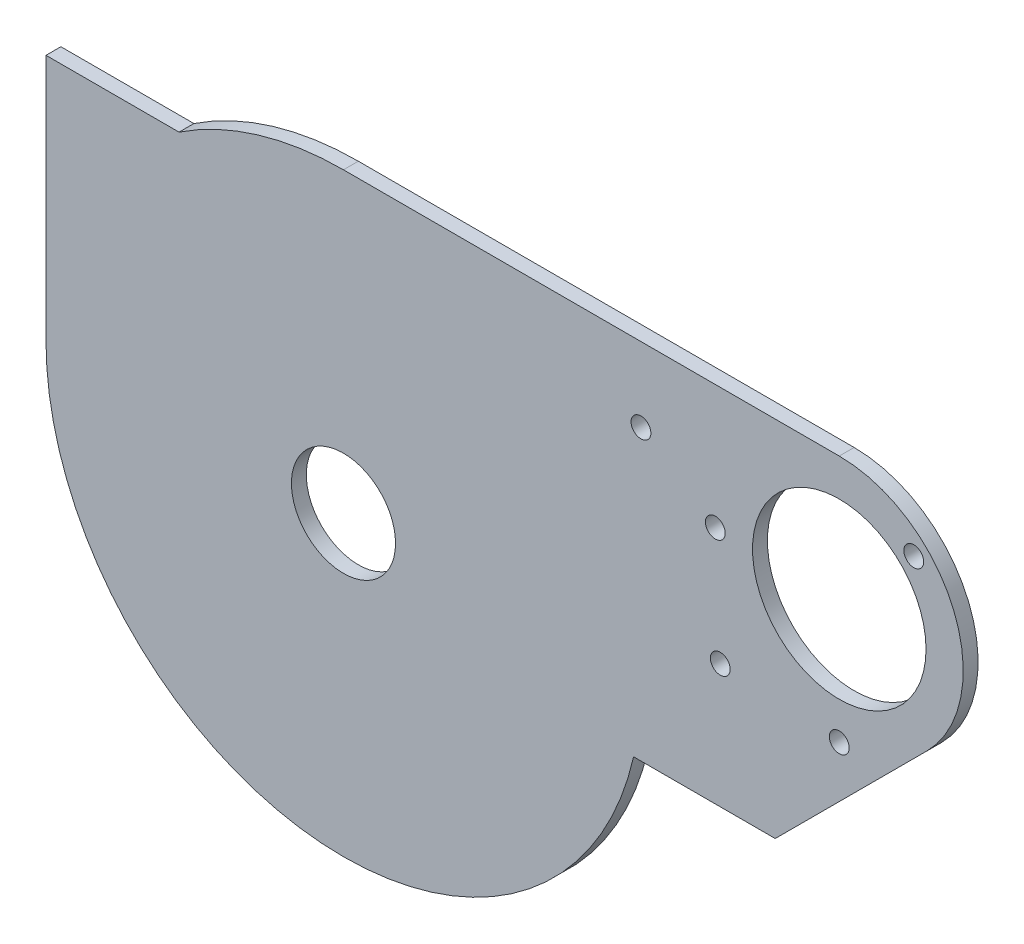
ISO-10303-21;
HEADER;
FILE_DESCRIPTION(('STEP AP214'),'2;1');
FILE_NAME('part.step','',(''),(''),'','','');
FILE_SCHEMA(('AUTOMOTIVE_DESIGN { 1 0 10303 214 1 1 1 1 }'));
ENDSEC;
DATA;
#1=APPLICATION_CONTEXT('core data for automotive mechanical design processes');
#2=APPLICATION_PROTOCOL_DEFINITION('international standard','automotive_design',2000,#1);
#3=PRODUCT_CONTEXT('',#1,'mechanical');
#4=PRODUCT('Part','Part','',(#3));
#5=PRODUCT_RELATED_PRODUCT_CATEGORY('part','',(#4));
#6=PRODUCT_DEFINITION_FORMATION('','',#4);
#7=PRODUCT_DEFINITION_CONTEXT('part definition',#1,'design');
#8=PRODUCT_DEFINITION('design','',#6,#7);
#9=PRODUCT_DEFINITION_SHAPE('','',#8);
#10=(LENGTH_UNIT() NAMED_UNIT(*) SI_UNIT(.MILLI.,.METRE.));
#11=(NAMED_UNIT(*) PLANE_ANGLE_UNIT() SI_UNIT($,.RADIAN.));
#12=(NAMED_UNIT(*) SI_UNIT($,.STERADIAN.) SOLID_ANGLE_UNIT());
#13=UNCERTAINTY_MEASURE_WITH_UNIT(LENGTH_MEASURE(1.E-05),#10,'distance_accuracy_value','');
#14=(GEOMETRIC_REPRESENTATION_CONTEXT(3) GLOBAL_UNCERTAINTY_ASSIGNED_CONTEXT((#13)) GLOBAL_UNIT_ASSIGNED_CONTEXT((#10,
#11,#12)) REPRESENTATION_CONTEXT('',''));
#15=CARTESIAN_POINT('',(0.,0.,0.));
#16=DIRECTION('',(0.,0.,1.));
#17=DIRECTION('',(1.,0.,0.));
#18=AXIS2_PLACEMENT_3D('',#15,#16,#17);
#19=CARTESIAN_POINT('',(-60.,0.,3.));
#20=DIRECTION('',(-1.,0.,0.));
#21=DIRECTION('',(0.,0.,1.));
#22=AXIS2_PLACEMENT_3D('',#19,#20,#21);
#23=PLANE('',#22);
#24=DIRECTION('',(0.,1.,0.));
#25=VECTOR('',#24,1.);
#26=CARTESIAN_POINT('',(-60.,0.,0.));
#27=LINE('',#26,#25);
#28=CARTESIAN_POINT('',(-60.,0.,0.));
#29=VERTEX_POINT('',#28);
#30=CARTESIAN_POINT('',(-60.,50.,0.));
#31=VERTEX_POINT('',#30);
#32=EDGE_CURVE('E139',#29,#31,#27,.T.);
#33=ORIENTED_EDGE('',*,*,#32,.F.);
#34=DIRECTION('',(0.,0.,-1.));
#35=VECTOR('',#34,1.);
#36=CARTESIAN_POINT('',(-60.,0.,3.));
#37=LINE('',#36,#35);
#38=CARTESIAN_POINT('',(-60.,0.,3.));
#39=VERTEX_POINT('',#38);
#40=EDGE_CURVE('E11',#39,#29,#37,.T.);
#41=ORIENTED_EDGE('',*,*,#40,.F.);
#42=DIRECTION('',(0.,1.,0.));
#43=VECTOR('',#42,1.);
#44=CARTESIAN_POINT('',(-60.,0.,3.));
#45=LINE('',#44,#43);
#46=CARTESIAN_POINT('',(-60.,50.,3.));
#47=VERTEX_POINT('',#46);
#48=EDGE_CURVE('E161',#39,#47,#45,.T.);
#49=ORIENTED_EDGE('',*,*,#48,.T.);
#50=DIRECTION('',(0.,0.,-1.));
#51=VECTOR('',#50,1.);
#52=CARTESIAN_POINT('',(-60.,50.,3.));
#53=LINE('',#52,#51);
#54=EDGE_CURVE('E87',#47,#31,#53,.T.);
#55=ORIENTED_EDGE('',*,*,#54,.T.);
#56=EDGE_LOOP('',(#33,#41,#49,#55));
#57=FACE_BOUND('',#56,.T.);
#58=ADVANCED_FACE('F37',(#57),#23,.T.);
#59=CARTESIAN_POINT('',(0.,0.,3.));
#60=DIRECTION('',(0.,0.,-1.));
#61=DIRECTION('',(-1.,0.,0.));
#62=AXIS2_PLACEMENT_3D('',#59,#60,#61);
#63=CYLINDRICAL_SURFACE('',#62,60.);
#64=CARTESIAN_POINT('',(0.,0.,0.));
#65=DIRECTION('',(0.,0.,1.));
#66=DIRECTION('',(1.,0.,0.));
#67=AXIS2_PLACEMENT_3D('',#64,#65,#66);
#68=CIRCLE('',#67,60.);
#69=CARTESIAN_POINT('',(58.5132004184799,-13.2742373335269,0.));
#70=VERTEX_POINT('',#69);
#71=EDGE_CURVE('E142',#29,#70,#68,.T.);
#72=ORIENTED_EDGE('',*,*,#71,.T.);
#73=DIRECTION('',(0.,0.,-1.));
#74=VECTOR('',#73,1.);
#75=CARTESIAN_POINT('',(58.5132004184799,-13.2742373335269,3.));
#76=LINE('',#75,#74);
#77=CARTESIAN_POINT('',(58.5132004184799,-13.2742373335269,3.));
#78=VERTEX_POINT('',#77);
#79=EDGE_CURVE('E45',#78,#70,#76,.T.);
#80=ORIENTED_EDGE('',*,*,#79,.F.);
#81=CARTESIAN_POINT('',(0.,0.,3.));
#82=DIRECTION('',(0.,0.,1.));
#83=DIRECTION('',(1.,0.,0.));
#84=AXIS2_PLACEMENT_3D('',#81,#82,#83);
#85=CIRCLE('',#84,60.);
#86=EDGE_CURVE('E121',#39,#78,#85,.T.);
#87=ORIENTED_EDGE('',*,*,#86,.F.);
#88=ORIENTED_EDGE('',*,*,#40,.T.);
#89=EDGE_LOOP('',(#72,#80,#87,#88));
#90=FACE_BOUND('',#89,.T.);
#91=ADVANCED_FACE('F199',(#90),#63,.T.);
#92=CARTESIAN_POINT('',(0.,-13.2742373335269,3.));
#93=DIRECTION('',(0.,1.,0.));
#94=DIRECTION('',(-1.,0.,0.));
#95=AXIS2_PLACEMENT_3D('',#92,#93,#94);
#96=PLANE('',#95);
#97=DIRECTION('',(1.,0.,0.));
#98=VECTOR('',#97,1.);
#99=CARTESIAN_POINT('',(0.,-13.2742373335269,0.));
#100=LINE('',#99,#98);
#101=CARTESIAN_POINT('',(87.0811017258004,-13.2742373335269,0.));
#102=VERTEX_POINT('',#101);
#103=EDGE_CURVE('E145',#70,#102,#100,.T.);
#104=ORIENTED_EDGE('',*,*,#103,.T.);
#105=DIRECTION('',(0.,0.,-1.));
#106=VECTOR('',#105,1.);
#107=CARTESIAN_POINT('',(87.0811017258004,-13.2742373335269,3.));
#108=LINE('',#107,#106);
#109=CARTESIAN_POINT('',(87.0811017258004,-13.2742373335269,3.));
#110=VERTEX_POINT('',#109);
#111=EDGE_CURVE('E168',#110,#102,#108,.T.);
#112=ORIENTED_EDGE('',*,*,#111,.F.);
#113=DIRECTION('',(1.,0.,0.));
#114=VECTOR('',#113,1.);
#115=CARTESIAN_POINT('',(0.,-13.2742373335269,3.));
#116=LINE('',#115,#114);
#117=EDGE_CURVE('E177',#78,#110,#116,.T.);
#118=ORIENTED_EDGE('',*,*,#117,.F.);
#119=ORIENTED_EDGE('',*,*,#79,.T.);
#120=EDGE_LOOP('',(#104,#112,#118,#119));
#121=FACE_BOUND('',#120,.T.);
#122=ADVANCED_FACE('F175',(#121),#96,.F.);
#123=CARTESIAN_POINT('',(50.1776695296637,-50.1776695296637,3.));
#124=DIRECTION('',(-0.707106781186547,0.707106781186548,0.));
#125=DIRECTION('',(-0.707106781186548,-0.707106781186547,0.));
#126=AXIS2_PLACEMENT_3D('',#123,#124,#125);
#127=PLANE('',#126);
#128=DIRECTION('',(0.707106781186548,0.707106781186547,0.));
#129=VECTOR('',#128,1.);
#130=CARTESIAN_POINT('',(50.1776695296637,-50.1776695296637,0.));
#131=LINE('',#130,#129);
#132=CARTESIAN_POINT('',(117.677669529664,17.3223304703363,0.));
#133=VERTEX_POINT('',#132);
#134=EDGE_CURVE('E147',#102,#133,#131,.T.);
#135=ORIENTED_EDGE('',*,*,#134,.T.);
#136=DIRECTION('',(0.,0.,-1.));
#137=VECTOR('',#136,1.);
#138=CARTESIAN_POINT('',(117.677669529664,17.3223304703363,3.));
#139=LINE('',#138,#137);
#140=CARTESIAN_POINT('',(117.677669529664,17.3223304703363,3.));
#141=VERTEX_POINT('',#140);
#142=EDGE_CURVE('E165',#141,#133,#139,.T.);
#143=ORIENTED_EDGE('',*,*,#142,.F.);
#144=DIRECTION('',(0.707106781186548,0.707106781186547,0.));
#145=VECTOR('',#144,1.);
#146=CARTESIAN_POINT('',(50.1776695296637,-50.1776695296637,3.));
#147=LINE('',#146,#145);
#148=EDGE_CURVE('E128',#110,#141,#147,.T.);
#149=ORIENTED_EDGE('',*,*,#148,.F.);
#150=ORIENTED_EDGE('',*,*,#111,.T.);
#151=EDGE_LOOP('',(#135,#143,#149,#150));
#152=FACE_BOUND('',#151,.T.);
#153=ADVANCED_FACE('F187',(#152),#127,.F.);
#154=CARTESIAN_POINT('',(100.,35.,3.));
#155=DIRECTION('',(0.,0.,-1.));
#156=DIRECTION('',(-1.,0.,0.));
#157=AXIS2_PLACEMENT_3D('',#154,#155,#156);
#158=CYLINDRICAL_SURFACE('',#157,25.);
#159=CARTESIAN_POINT('',(100.,35.,0.));
#160=DIRECTION('',(0.,0.,1.));
#161=DIRECTION('',(1.,0.,0.));
#162=AXIS2_PLACEMENT_3D('',#159,#160,#161);
#163=CIRCLE('',#162,25.);
#164=CARTESIAN_POINT('',(100.,60.,0.));
#165=VERTEX_POINT('',#164);
#166=EDGE_CURVE('E149',#133,#165,#163,.T.);
#167=ORIENTED_EDGE('',*,*,#166,.T.);
#168=DIRECTION('',(0.,0.,-1.));
#169=VECTOR('',#168,1.);
#170=CARTESIAN_POINT('',(100.,60.,3.));
#171=LINE('',#170,#169);
#172=CARTESIAN_POINT('',(100.,60.,3.));
#173=VERTEX_POINT('',#172);
#174=EDGE_CURVE('E115',#173,#165,#171,.T.);
#175=ORIENTED_EDGE('',*,*,#174,.F.);
#176=CARTESIAN_POINT('',(100.,35.,3.));
#177=DIRECTION('',(0.,0.,1.));
#178=DIRECTION('',(1.,0.,0.));
#179=AXIS2_PLACEMENT_3D('',#176,#177,#178);
#180=CIRCLE('',#179,25.);
#181=EDGE_CURVE('E125',#141,#173,#180,.T.);
#182=ORIENTED_EDGE('',*,*,#181,.F.);
#183=ORIENTED_EDGE('',*,*,#142,.T.);
#184=EDGE_LOOP('',(#167,#175,#182,#183));
#185=FACE_BOUND('',#184,.T.);
#186=ADVANCED_FACE('F190',(#185),#158,.T.);
#187=CARTESIAN_POINT('',(0.,60.,3.));
#188=DIRECTION('',(0.,1.,0.));
#189=DIRECTION('',(-1.,0.,0.));
#190=AXIS2_PLACEMENT_3D('',#187,#188,#189);
#191=PLANE('',#190);
#192=DIRECTION('',(1.,0.,0.));
#193=VECTOR('',#192,1.);
#194=CARTESIAN_POINT('',(0.,60.,0.));
#195=LINE('',#194,#193);
#196=CARTESIAN_POINT('',(0.,60.,0.));
#197=VERTEX_POINT('',#196);
#198=EDGE_CURVE('E114',#197,#165,#195,.T.);
#199=ORIENTED_EDGE('',*,*,#198,.F.);
#200=DIRECTION('',(0.,0.,-1.));
#201=VECTOR('',#200,1.);
#202=CARTESIAN_POINT('',(0.,60.,3.));
#203=LINE('',#202,#201);
#204=CARTESIAN_POINT('',(0.,60.,3.));
#205=VERTEX_POINT('',#204);
#206=EDGE_CURVE('E108',#205,#197,#203,.T.);
#207=ORIENTED_EDGE('',*,*,#206,.F.);
#208=DIRECTION('',(1.,0.,0.));
#209=VECTOR('',#208,1.);
#210=CARTESIAN_POINT('',(0.,60.,3.));
#211=LINE('',#210,#209);
#212=EDGE_CURVE('E112',#205,#173,#211,.T.);
#213=ORIENTED_EDGE('',*,*,#212,.T.);
#214=ORIENTED_EDGE('',*,*,#174,.T.);
#215=EDGE_LOOP('',(#199,#207,#213,#214));
#216=FACE_BOUND('',#215,.T.);
#217=ADVANCED_FACE('F110',(#216),#191,.T.);
#218=CARTESIAN_POINT('',(-33.166247903554,50.,0.));
#219=VERTEX_POINT('',#218);
#220=EDGE_CURVE('E80',#197,#219,#68,.T.);
#221=ORIENTED_EDGE('',*,*,#220,.T.);
#222=DIRECTION('',(0.,0.,-1.));
#223=VECTOR('',#222,1.);
#224=CARTESIAN_POINT('',(-33.166247903554,50.,3.));
#225=LINE('',#224,#223);
#226=CARTESIAN_POINT('',(-33.166247903554,50.,3.));
#227=VERTEX_POINT('',#226);
#228=EDGE_CURVE('E116',#227,#219,#225,.T.);
#229=ORIENTED_EDGE('',*,*,#228,.F.);
#230=EDGE_CURVE('E118',#205,#227,#85,.T.);
#231=ORIENTED_EDGE('',*,*,#230,.F.);
#232=ORIENTED_EDGE('',*,*,#206,.T.);
#233=EDGE_LOOP('',(#221,#229,#231,#232));
#234=FACE_BOUND('',#233,.T.);
#235=ADVANCED_FACE('F119',(#234),#63,.T.);
#236=CARTESIAN_POINT('',(100.,35.,3.));
#237=DIRECTION('',(0.,0.,-1.));
#238=DIRECTION('',(-1.,0.,0.));
#239=AXIS2_PLACEMENT_3D('',#236,#237,#238);
#240=CYLINDRICAL_SURFACE('',#239,17.5);
#241=CARTESIAN_POINT('',(100.,35.,3.));
#242=DIRECTION('',(0.,0.,1.));
#243=DIRECTION('',(1.,0.,0.));
#244=AXIS2_PLACEMENT_3D('',#241,#242,#243);
#245=CIRCLE('',#244,17.5);
#246=CARTESIAN_POINT('',(117.5,35.,3.));
#247=VERTEX_POINT('',#246);
#248=EDGE_CURVE('E133',#247,#247,#245,.T.);
#249=ORIENTED_EDGE('',*,*,#248,.T.);
#250=EDGE_LOOP('',(#249));
#251=FACE_BOUND('',#250,.T.);
#252=CARTESIAN_POINT('',(100.,35.,0.));
#253=DIRECTION('',(0.,0.,1.));
#254=DIRECTION('',(1.,0.,0.));
#255=AXIS2_PLACEMENT_3D('',#252,#253,#254);
#256=CIRCLE('',#255,17.5);
#257=CARTESIAN_POINT('',(117.5,35.,0.));
#258=VERTEX_POINT('',#257);
#259=EDGE_CURVE('E155',#258,#258,#256,.T.);
#260=ORIENTED_EDGE('',*,*,#259,.F.);
#261=EDGE_LOOP('',(#260));
#262=FACE_BOUND('',#261,.T.);
#263=ADVANCED_FACE('F209',(#251,#262),#240,.F.);
#264=CARTESIAN_POINT('',(0.,50.,3.));
#265=DIRECTION('',(0.,-1.,0.));
#266=DIRECTION('',(0.,0.,-1.));
#267=AXIS2_PLACEMENT_3D('',#264,#265,#266);
#268=PLANE('',#267);
#269=DIRECTION('',(-1.,0.,0.));
#270=VECTOR('',#269,1.);
#271=CARTESIAN_POINT('',(0.,50.,0.));
#272=LINE('',#271,#270);
#273=EDGE_CURVE('E153',#219,#31,#272,.T.);
#274=ORIENTED_EDGE('',*,*,#273,.T.);
#275=ORIENTED_EDGE('',*,*,#54,.F.);
#276=DIRECTION('',(-1.,0.,0.));
#277=VECTOR('',#276,1.);
#278=CARTESIAN_POINT('',(0.,50.,3.));
#279=LINE('',#278,#277);
#280=EDGE_CURVE('E53',#227,#47,#279,.T.);
#281=ORIENTED_EDGE('',*,*,#280,.F.);
#282=ORIENTED_EDGE('',*,*,#228,.T.);
#283=EDGE_LOOP('',(#274,#275,#281,#282));
#284=FACE_BOUND('',#283,.T.);
#285=ADVANCED_FACE('F193',(#284),#268,.F.);
#286=CARTESIAN_POINT('',(0.,0.,3.));
#287=DIRECTION('',(0.,0.,-1.));
#288=DIRECTION('',(-1.,0.,0.));
#289=AXIS2_PLACEMENT_3D('',#286,#287,#288);
#290=CYLINDRICAL_SURFACE('',#289,10.5);
#291=CARTESIAN_POINT('',(0.,0.,3.));
#292=DIRECTION('',(0.,0.,1.));
#293=DIRECTION('',(1.,0.,0.));
#294=AXIS2_PLACEMENT_3D('',#291,#292,#293);
#295=CIRCLE('',#294,10.5);
#296=CARTESIAN_POINT('',(10.5,0.,3.));
#297=VERTEX_POINT('',#296);
#298=EDGE_CURVE('E136',#297,#297,#295,.T.);
#299=ORIENTED_EDGE('',*,*,#298,.T.);
#300=EDGE_LOOP('',(#299));
#301=FACE_BOUND('',#300,.T.);
#302=CARTESIAN_POINT('',(0.,0.,0.));
#303=DIRECTION('',(0.,0.,1.));
#304=DIRECTION('',(1.,0.,0.));
#305=AXIS2_PLACEMENT_3D('',#302,#303,#304);
#306=CIRCLE('',#305,10.5);
#307=CARTESIAN_POINT('',(10.5,0.,0.));
#308=VERTEX_POINT('',#307);
#309=EDGE_CURVE('E158',#308,#308,#306,.T.);
#310=ORIENTED_EDGE('',*,*,#309,.F.);
#311=EDGE_LOOP('',(#310));
#312=FACE_BOUND('',#311,.T.);
#313=ADVANCED_FACE('F253',(#301,#312),#290,.F.);
#314=CARTESIAN_POINT('',(0.,0.,3.));
#315=DIRECTION('',(0.,0.,1.));
#316=DIRECTION('',(1.,0.,0.));
#317=AXIS2_PLACEMENT_3D('',#314,#315,#316);
#318=PLANE('',#317);
#319=CARTESIAN_POINT('',(100.,9.99999999999998,3.));
#320=DIRECTION('',(0.,0.,1.));
#321=DIRECTION('',(1.,0.,0.));
#322=AXIS2_PLACEMENT_3D('',#319,#320,#321);
#323=CIRCLE('',#322,2.);
#324=CARTESIAN_POINT('',(102.,9.99999999999998,3.));
#325=VERTEX_POINT('',#324);
#326=EDGE_CURVE('E338',#325,#325,#323,.T.);
#327=ORIENTED_EDGE('',*,*,#326,.F.);
#328=EDGE_LOOP('',(#327));
#329=FACE_BOUND('',#328,.T.);
#330=CARTESIAN_POINT('',(75.,35.,3.));
#331=DIRECTION('',(0.,0.,1.));
#332=DIRECTION('',(1.,0.,0.));
#333=AXIS2_PLACEMENT_3D('',#330,#331,#332);
#334=CIRCLE('',#333,2.);
#335=CARTESIAN_POINT('',(77.,35.,3.));
#336=VERTEX_POINT('',#335);
#337=EDGE_CURVE('E348',#336,#336,#334,.T.);
#338=ORIENTED_EDGE('',*,*,#337,.F.);
#339=EDGE_LOOP('',(#338));
#340=FACE_BOUND('',#339,.T.);
#341=CARTESIAN_POINT('',(115.026019100214,50.0260191002142,3.));
#342=DIRECTION('',(0.,0.,1.));
#343=DIRECTION('',(1.,0.,0.));
#344=AXIS2_PLACEMENT_3D('',#341,#342,#343);
#345=CIRCLE('',#344,2.);
#346=CARTESIAN_POINT('',(117.026019100214,50.0260191002142,3.));
#347=VERTEX_POINT('',#346);
#348=EDGE_CURVE('E354',#347,#347,#345,.T.);
#349=ORIENTED_EDGE('',*,*,#348,.F.);
#350=EDGE_LOOP('',(#349));
#351=FACE_BOUND('',#350,.T.);
#352=CARTESIAN_POINT('',(60.,45.,3.));
#353=DIRECTION('',(0.,0.,1.));
#354=DIRECTION('',(1.,0.,0.));
#355=AXIS2_PLACEMENT_3D('',#352,#353,#354);
#356=CIRCLE('',#355,2.);
#357=CARTESIAN_POINT('',(62.,45.,3.));
#358=VERTEX_POINT('',#357);
#359=EDGE_CURVE('E359',#358,#358,#356,.T.);
#360=ORIENTED_EDGE('',*,*,#359,.F.);
#361=EDGE_LOOP('',(#360));
#362=FACE_BOUND('',#361,.T.);
#363=CARTESIAN_POINT('',(76.,11.7257626664731,3.));
#364=DIRECTION('',(0.,0.,1.));
#365=DIRECTION('',(1.,0.,0.));
#366=AXIS2_PLACEMENT_3D('',#363,#364,#365);
#367=CIRCLE('',#366,2.);
#368=CARTESIAN_POINT('',(78.,11.7257626664731,3.));
#369=VERTEX_POINT('',#368);
#370=EDGE_CURVE('E196',#369,#369,#367,.T.);
#371=ORIENTED_EDGE('',*,*,#370,.F.);
#372=EDGE_LOOP('',(#371));
#373=FACE_BOUND('',#372,.T.);
#374=ORIENTED_EDGE('',*,*,#48,.F.);
#375=ORIENTED_EDGE('',*,*,#86,.T.);
#376=ORIENTED_EDGE('',*,*,#117,.T.);
#377=ORIENTED_EDGE('',*,*,#148,.T.);
#378=ORIENTED_EDGE('',*,*,#181,.T.);
#379=ORIENTED_EDGE('',*,*,#212,.F.);
#380=ORIENTED_EDGE('',*,*,#230,.T.);
#381=ORIENTED_EDGE('',*,*,#280,.T.);
#382=EDGE_LOOP('',(#374,#375,#376,#377,#378,#379,#380,#381));
#383=FACE_BOUND('',#382,.T.);
#384=ORIENTED_EDGE('',*,*,#248,.F.);
#385=EDGE_LOOP('',(#384));
#386=FACE_BOUND('',#385,.T.);
#387=ORIENTED_EDGE('',*,*,#298,.F.);
#388=EDGE_LOOP('',(#387));
#389=FACE_BOUND('',#388,.T.);
#390=ADVANCED_FACE('F122',(#329,#340,#351,#362,#373,#383,#386,#389),#318,.T.);
#391=CARTESIAN_POINT('',(0.,0.,0.));
#392=DIRECTION('',(0.,0.,1.));
#393=DIRECTION('',(1.,0.,0.));
#394=AXIS2_PLACEMENT_3D('',#391,#392,#393);
#395=PLANE('',#394);
#396=CARTESIAN_POINT('',(100.,9.99999999999998,0.));
#397=DIRECTION('',(0.,0.,1.));
#398=DIRECTION('',(1.,0.,0.));
#399=AXIS2_PLACEMENT_3D('',#396,#397,#398);
#400=CIRCLE('',#399,2.);
#401=CARTESIAN_POINT('',(102.,9.99999999999998,0.));
#402=VERTEX_POINT('',#401);
#403=EDGE_CURVE('E341',#402,#402,#400,.F.);
#404=ORIENTED_EDGE('',*,*,#403,.F.);
#405=EDGE_LOOP('',(#404));
#406=FACE_BOUND('',#405,.T.);
#407=CARTESIAN_POINT('',(75.,35.,0.));
#408=DIRECTION('',(0.,0.,1.));
#409=DIRECTION('',(1.,0.,0.));
#410=AXIS2_PLACEMENT_3D('',#407,#408,#409);
#411=CIRCLE('',#410,2.);
#412=CARTESIAN_POINT('',(77.,35.,0.));
#413=VERTEX_POINT('',#412);
#414=EDGE_CURVE('E345',#413,#413,#411,.F.);
#415=ORIENTED_EDGE('',*,*,#414,.F.);
#416=EDGE_LOOP('',(#415));
#417=FACE_BOUND('',#416,.T.);
#418=CARTESIAN_POINT('',(115.026019100214,50.0260191002142,0.));
#419=DIRECTION('',(0.,0.,1.));
#420=DIRECTION('',(1.,0.,0.));
#421=AXIS2_PLACEMENT_3D('',#418,#419,#420);
#422=CIRCLE('',#421,2.);
#423=CARTESIAN_POINT('',(117.026019100214,50.0260191002142,0.));
#424=VERTEX_POINT('',#423);
#425=EDGE_CURVE('E351',#424,#424,#422,.F.);
#426=ORIENTED_EDGE('',*,*,#425,.F.);
#427=EDGE_LOOP('',(#426));
#428=FACE_BOUND('',#427,.T.);
#429=CARTESIAN_POINT('',(60.,45.,0.));
#430=DIRECTION('',(0.,0.,1.));
#431=DIRECTION('',(1.,0.,0.));
#432=AXIS2_PLACEMENT_3D('',#429,#430,#431);
#433=CIRCLE('',#432,2.);
#434=CARTESIAN_POINT('',(62.,45.,0.));
#435=VERTEX_POINT('',#434);
#436=EDGE_CURVE('E143',#435,#435,#433,.F.);
#437=ORIENTED_EDGE('',*,*,#436,.F.);
#438=EDGE_LOOP('',(#437));
#439=FACE_BOUND('',#438,.T.);
#440=CARTESIAN_POINT('',(76.,11.7257626664731,0.));
#441=DIRECTION('',(0.,0.,1.));
#442=DIRECTION('',(1.,0.,0.));
#443=AXIS2_PLACEMENT_3D('',#440,#441,#442);
#444=CIRCLE('',#443,2.);
#445=CARTESIAN_POINT('',(78.,11.7257626664731,0.));
#446=VERTEX_POINT('',#445);
#447=EDGE_CURVE('E342',#446,#446,#444,.F.);
#448=ORIENTED_EDGE('',*,*,#447,.F.);
#449=EDGE_LOOP('',(#448));
#450=FACE_BOUND('',#449,.T.);
#451=ORIENTED_EDGE('',*,*,#32,.T.);
#452=ORIENTED_EDGE('',*,*,#273,.F.);
#453=ORIENTED_EDGE('',*,*,#220,.F.);
#454=ORIENTED_EDGE('',*,*,#198,.T.);
#455=ORIENTED_EDGE('',*,*,#166,.F.);
#456=ORIENTED_EDGE('',*,*,#134,.F.);
#457=ORIENTED_EDGE('',*,*,#103,.F.);
#458=ORIENTED_EDGE('',*,*,#71,.F.);
#459=EDGE_LOOP('',(#451,#452,#453,#454,#455,#456,#457,#458));
#460=FACE_BOUND('',#459,.T.);
#461=ORIENTED_EDGE('',*,*,#259,.T.);
#462=EDGE_LOOP('',(#461));
#463=FACE_BOUND('',#462,.T.);
#464=ORIENTED_EDGE('',*,*,#309,.T.);
#465=EDGE_LOOP('',(#464));
#466=FACE_BOUND('',#465,.T.);
#467=ADVANCED_FACE('F182',(#406,#417,#428,#439,#450,#460,#463,#466),#395,.F.);
#468=CARTESIAN_POINT('',(76.,11.7257626664731,-0.00100000000000013));
#469=DIRECTION('',(0.,0.,1.));
#470=DIRECTION('',(1.,0.,0.));
#471=AXIS2_PLACEMENT_3D('',#468,#469,#470);
#472=CYLINDRICAL_SURFACE('',#471,2.);
#473=CARTESIAN_POINT('',(78.,11.7257626664731,3.));
#474=CARTESIAN_POINT('',(78.,11.7257626664731,2.96875));
#475=CARTESIAN_POINT('',(78.,11.7257626664731,2.9375));
#476=CARTESIAN_POINT('',(78.,11.7257626664731,2.875));
#477=CARTESIAN_POINT('',(78.,11.7257626664731,2.84375));
#478=CARTESIAN_POINT('',(78.,11.7257626664731,2.78125));
#479=CARTESIAN_POINT('',(78.,11.7257626664731,2.75));
#480=CARTESIAN_POINT('',(78.,11.7257626664731,2.6875));
#481=CARTESIAN_POINT('',(78.,11.7257626664731,2.65625));
#482=CARTESIAN_POINT('',(78.,11.7257626664731,2.59375));
#483=CARTESIAN_POINT('',(78.,11.7257626664731,2.5625));
#484=CARTESIAN_POINT('',(78.,11.7257626664731,2.5));
#485=CARTESIAN_POINT('',(78.,11.7257626664731,2.46875));
#486=CARTESIAN_POINT('',(78.,11.7257626664731,2.40625));
#487=CARTESIAN_POINT('',(78.,11.7257626664731,2.375));
#488=CARTESIAN_POINT('',(78.,11.7257626664731,2.3125));
#489=CARTESIAN_POINT('',(78.,11.7257626664731,2.28125));
#490=CARTESIAN_POINT('',(78.,11.7257626664731,2.21875));
#491=CARTESIAN_POINT('',(78.,11.7257626664731,2.1875));
#492=CARTESIAN_POINT('',(78.,11.7257626664731,2.125));
#493=CARTESIAN_POINT('',(78.,11.7257626664731,2.09375));
#494=CARTESIAN_POINT('',(78.,11.7257626664731,2.03125));
#495=CARTESIAN_POINT('',(78.,11.7257626664731,2.));
#496=CARTESIAN_POINT('',(78.,11.7257626664731,1.9375));
#497=CARTESIAN_POINT('',(78.,11.7257626664731,1.90625));
#498=CARTESIAN_POINT('',(78.,11.7257626664731,1.84375));
#499=CARTESIAN_POINT('',(78.,11.7257626664731,1.8125));
#500=CARTESIAN_POINT('',(78.,11.7257626664731,1.75));
#501=CARTESIAN_POINT('',(78.,11.7257626664731,1.71875));
#502=CARTESIAN_POINT('',(78.,11.7257626664731,1.65625));
#503=CARTESIAN_POINT('',(78.,11.7257626664731,1.625));
#504=CARTESIAN_POINT('',(78.,11.7257626664731,1.5625));
#505=CARTESIAN_POINT('',(78.,11.7257626664731,1.53125));
#506=CARTESIAN_POINT('',(78.,11.7257626664731,1.46875));
#507=CARTESIAN_POINT('',(78.,11.7257626664731,1.4375));
#508=CARTESIAN_POINT('',(78.,11.7257626664731,1.375));
#509=CARTESIAN_POINT('',(78.,11.7257626664731,1.34375));
#510=CARTESIAN_POINT('',(78.,11.7257626664731,1.28125));
#511=CARTESIAN_POINT('',(78.,11.7257626664731,1.25));
#512=CARTESIAN_POINT('',(78.,11.7257626664731,1.1875));
#513=CARTESIAN_POINT('',(78.,11.7257626664731,1.15625));
#514=CARTESIAN_POINT('',(78.,11.7257626664731,1.09375));
#515=CARTESIAN_POINT('',(78.,11.7257626664731,1.0625));
#516=CARTESIAN_POINT('',(78.,11.7257626664731,1.));
#517=CARTESIAN_POINT('',(78.,11.7257626664731,0.96875));
#518=CARTESIAN_POINT('',(78.,11.7257626664731,0.90625));
#519=CARTESIAN_POINT('',(78.,11.7257626664731,0.875));
#520=CARTESIAN_POINT('',(78.,11.7257626664731,0.8125));
#521=CARTESIAN_POINT('',(78.,11.7257626664731,0.78125));
#522=CARTESIAN_POINT('',(78.,11.7257626664731,0.71875));
#523=CARTESIAN_POINT('',(78.,11.7257626664731,0.6875));
#524=CARTESIAN_POINT('',(78.,11.7257626664731,0.625));
#525=CARTESIAN_POINT('',(78.,11.7257626664731,0.59375));
#526=CARTESIAN_POINT('',(78.,11.7257626664731,0.53125));
#527=CARTESIAN_POINT('',(78.,11.7257626664731,0.5));
#528=CARTESIAN_POINT('',(78.,11.7257626664731,0.4375));
#529=CARTESIAN_POINT('',(78.,11.7257626664731,0.40625));
#530=CARTESIAN_POINT('',(78.,11.7257626664731,0.34375));
#531=CARTESIAN_POINT('',(78.,11.7257626664731,0.3125));
#532=CARTESIAN_POINT('',(78.,11.7257626664731,0.25));
#533=CARTESIAN_POINT('',(78.,11.7257626664731,0.21875));
#534=CARTESIAN_POINT('',(78.,11.7257626664731,0.15625));
#535=CARTESIAN_POINT('',(78.,11.7257626664731,0.125));
#536=CARTESIAN_POINT('',(78.,11.7257626664731,0.0625000000000001));
#537=CARTESIAN_POINT('',(78.,11.7257626664731,0.0312500000000001));
#538=CARTESIAN_POINT('',(78.,11.7257626664731,0.));
#539=B_SPLINE_CURVE_WITH_KNOTS('',3,(#473,#474,#475,#476,#477,#478,#479,#480,#481,#482,#483,
#484,#485,#486,#487,#488,#489,#490,#491,#492,#493,#494,#495,#496,#497,#498,#499,#500,#501,#502,
#503,#504,#505,#506,#507,#508,#509,#510,#511,#512,#513,#514,#515,#516,#517,#518,#519,#520,#521,
#522,#523,#524,#525,#526,#527,#528,#529,#530,#531,#532,#533,#534,#535,#536,#537,#538),
.UNSPECIFIED.,.F.,.F.,(4,2,2,2,2,2,2,2,2,2,2,2,2,2,2,2,2,2,2,2,2,2,2,2,2,2,2,2,2,2,2,2,4),(0.,
0.0937500000000001,0.1875,0.28125,0.375,0.46875,0.5625,0.65625,0.75,0.84375,0.9375,1.03125,
1.125,1.21875,1.3125,1.40625,1.5,1.59375,1.6875,1.78125,1.875,1.96875,2.0625,2.15625,2.25,
2.34375,2.4375,2.53125,2.625,2.71875,2.8125,2.90625,3.),.UNSPECIFIED.);
#540=EDGE_CURVE('BSEAM268',#369,#446,#539,.T.);
#541=ORIENTED_EDGE('',*,*,#370,.T.);
#542=ORIENTED_EDGE('',*,*,#447,.T.);
#543=ORIENTED_EDGE('',*,*,#540,.T.);
#544=ORIENTED_EDGE('',*,*,#540,.F.);
#545=EDGE_LOOP('',(#541,#543,#542,#544));
#546=FACE_BOUND('',#545,.T.);
#547=ADVANCED_FACE('F268',(#546),#472,.F.);
#548=CARTESIAN_POINT('',(60.,45.,-0.00100000000000013));
#549=DIRECTION('',(0.,0.,1.));
#550=DIRECTION('',(1.,0.,0.));
#551=AXIS2_PLACEMENT_3D('',#548,#549,#550);
#552=CYLINDRICAL_SURFACE('',#551,2.);
#553=CARTESIAN_POINT('',(62.,45.,3.));
#554=CARTESIAN_POINT('',(62.,45.,2.96875));
#555=CARTESIAN_POINT('',(62.,45.,2.9375));
#556=CARTESIAN_POINT('',(62.,45.,2.875));
#557=CARTESIAN_POINT('',(62.,45.,2.84375));
#558=CARTESIAN_POINT('',(62.,45.,2.78125));
#559=CARTESIAN_POINT('',(62.,45.,2.75));
#560=CARTESIAN_POINT('',(62.,45.,2.6875));
#561=CARTESIAN_POINT('',(62.,45.,2.65625));
#562=CARTESIAN_POINT('',(62.,45.,2.59375));
#563=CARTESIAN_POINT('',(62.,45.,2.5625));
#564=CARTESIAN_POINT('',(62.,45.,2.5));
#565=CARTESIAN_POINT('',(62.,45.,2.46875));
#566=CARTESIAN_POINT('',(62.,45.,2.40625));
#567=CARTESIAN_POINT('',(62.,45.,2.375));
#568=CARTESIAN_POINT('',(62.,45.,2.3125));
#569=CARTESIAN_POINT('',(62.,45.,2.28125));
#570=CARTESIAN_POINT('',(62.,45.,2.21875));
#571=CARTESIAN_POINT('',(62.,45.,2.1875));
#572=CARTESIAN_POINT('',(62.,45.,2.125));
#573=CARTESIAN_POINT('',(62.,45.,2.09375));
#574=CARTESIAN_POINT('',(62.,45.,2.03125));
#575=CARTESIAN_POINT('',(62.,45.,2.));
#576=CARTESIAN_POINT('',(62.,45.,1.9375));
#577=CARTESIAN_POINT('',(62.,45.,1.90625));
#578=CARTESIAN_POINT('',(62.,45.,1.84375));
#579=CARTESIAN_POINT('',(62.,45.,1.8125));
#580=CARTESIAN_POINT('',(62.,45.,1.75));
#581=CARTESIAN_POINT('',(62.,45.,1.71875));
#582=CARTESIAN_POINT('',(62.,45.,1.65625));
#583=CARTESIAN_POINT('',(62.,45.,1.625));
#584=CARTESIAN_POINT('',(62.,45.,1.5625));
#585=CARTESIAN_POINT('',(62.,45.,1.53125));
#586=CARTESIAN_POINT('',(62.,45.,1.46875));
#587=CARTESIAN_POINT('',(62.,45.,1.4375));
#588=CARTESIAN_POINT('',(62.,45.,1.375));
#589=CARTESIAN_POINT('',(62.,45.,1.34375));
#590=CARTESIAN_POINT('',(62.,45.,1.28125));
#591=CARTESIAN_POINT('',(62.,45.,1.25));
#592=CARTESIAN_POINT('',(62.,45.,1.1875));
#593=CARTESIAN_POINT('',(62.,45.,1.15625));
#594=CARTESIAN_POINT('',(62.,45.,1.09375));
#595=CARTESIAN_POINT('',(62.,45.,1.0625));
#596=CARTESIAN_POINT('',(62.,45.,1.));
#597=CARTESIAN_POINT('',(62.,45.,0.96875));
#598=CARTESIAN_POINT('',(62.,45.,0.90625));
#599=CARTESIAN_POINT('',(62.,45.,0.875));
#600=CARTESIAN_POINT('',(62.,45.,0.8125));
#601=CARTESIAN_POINT('',(62.,45.,0.78125));
#602=CARTESIAN_POINT('',(62.,45.,0.71875));
#603=CARTESIAN_POINT('',(62.,45.,0.6875));
#604=CARTESIAN_POINT('',(62.,45.,0.625));
#605=CARTESIAN_POINT('',(62.,45.,0.59375));
#606=CARTESIAN_POINT('',(62.,45.,0.53125));
#607=CARTESIAN_POINT('',(62.,45.,0.5));
#608=CARTESIAN_POINT('',(62.,45.,0.4375));
#609=CARTESIAN_POINT('',(62.,45.,0.40625));
#610=CARTESIAN_POINT('',(62.,45.,0.34375));
#611=CARTESIAN_POINT('',(62.,45.,0.3125));
#612=CARTESIAN_POINT('',(62.,45.,0.25));
#613=CARTESIAN_POINT('',(62.,45.,0.21875));
#614=CARTESIAN_POINT('',(62.,45.,0.15625));
#615=CARTESIAN_POINT('',(62.,45.,0.125));
#616=CARTESIAN_POINT('',(62.,45.,0.0625000000000001));
#617=CARTESIAN_POINT('',(62.,45.,0.0312500000000001));
#618=CARTESIAN_POINT('',(62.,45.,0.));
#619=B_SPLINE_CURVE_WITH_KNOTS('',3,(#553,#554,#555,#556,#557,#558,#559,#560,#561,#562,#563,
#564,#565,#566,#567,#568,#569,#570,#571,#572,#573,#574,#575,#576,#577,#578,#579,#580,#581,#582,
#583,#584,#585,#586,#587,#588,#589,#590,#591,#592,#593,#594,#595,#596,#597,#598,#599,#600,#601,
#602,#603,#604,#605,#606,#607,#608,#609,#610,#611,#612,#613,#614,#615,#616,#617,#618),
.UNSPECIFIED.,.F.,.F.,(4,2,2,2,2,2,2,2,2,2,2,2,2,2,2,2,2,2,2,2,2,2,2,2,2,2,2,2,2,2,2,2,4),(0.,
0.0937500000000001,0.1875,0.28125,0.375,0.46875,0.5625,0.65625,0.75,0.84375,0.9375,1.03125,
1.125,1.21875,1.3125,1.40625,1.5,1.59375,1.6875,1.78125,1.875,1.96875,2.0625,2.15625,2.25,
2.34375,2.4375,2.53125,2.625,2.71875,2.8125,2.90625,3.),.UNSPECIFIED.);
#620=EDGE_CURVE('BSEAM273',#358,#435,#619,.T.);
#621=ORIENTED_EDGE('',*,*,#359,.T.);
#622=ORIENTED_EDGE('',*,*,#436,.T.);
#623=ORIENTED_EDGE('',*,*,#620,.T.);
#624=ORIENTED_EDGE('',*,*,#620,.F.);
#625=EDGE_LOOP('',(#621,#623,#622,#624));
#626=FACE_BOUND('',#625,.T.);
#627=ADVANCED_FACE('F273',(#626),#552,.F.);
#628=CARTESIAN_POINT('',(115.026019100214,50.0260191002142,-0.00100000000000013));
#629=DIRECTION('',(0.,0.,1.));
#630=DIRECTION('',(1.,0.,0.));
#631=AXIS2_PLACEMENT_3D('',#628,#629,#630);
#632=CYLINDRICAL_SURFACE('',#631,2.);
#633=CARTESIAN_POINT('',(117.026019100214,50.0260191002142,3.));
#634=CARTESIAN_POINT('',(117.026019100214,50.0260191002142,2.96875));
#635=CARTESIAN_POINT('',(117.026019100214,50.0260191002142,2.9375));
#636=CARTESIAN_POINT('',(117.026019100214,50.0260191002142,2.875));
#637=CARTESIAN_POINT('',(117.026019100214,50.0260191002142,2.84375));
#638=CARTESIAN_POINT('',(117.026019100214,50.0260191002142,2.78125));
#639=CARTESIAN_POINT('',(117.026019100214,50.0260191002142,2.75));
#640=CARTESIAN_POINT('',(117.026019100214,50.0260191002142,2.6875));
#641=CARTESIAN_POINT('',(117.026019100214,50.0260191002142,2.65625));
#642=CARTESIAN_POINT('',(117.026019100214,50.0260191002142,2.59375));
#643=CARTESIAN_POINT('',(117.026019100214,50.0260191002142,2.5625));
#644=CARTESIAN_POINT('',(117.026019100214,50.0260191002142,2.5));
#645=CARTESIAN_POINT('',(117.026019100214,50.0260191002142,2.46875));
#646=CARTESIAN_POINT('',(117.026019100214,50.0260191002142,2.40625));
#647=CARTESIAN_POINT('',(117.026019100214,50.0260191002142,2.375));
#648=CARTESIAN_POINT('',(117.026019100214,50.0260191002142,2.3125));
#649=CARTESIAN_POINT('',(117.026019100214,50.0260191002142,2.28125));
#650=CARTESIAN_POINT('',(117.026019100214,50.0260191002142,2.21875));
#651=CARTESIAN_POINT('',(117.026019100214,50.0260191002142,2.1875));
#652=CARTESIAN_POINT('',(117.026019100214,50.0260191002142,2.125));
#653=CARTESIAN_POINT('',(117.026019100214,50.0260191002142,2.09375));
#654=CARTESIAN_POINT('',(117.026019100214,50.0260191002142,2.03125));
#655=CARTESIAN_POINT('',(117.026019100214,50.0260191002142,2.));
#656=CARTESIAN_POINT('',(117.026019100214,50.0260191002142,1.9375));
#657=CARTESIAN_POINT('',(117.026019100214,50.0260191002142,1.90625));
#658=CARTESIAN_POINT('',(117.026019100214,50.0260191002142,1.84375));
#659=CARTESIAN_POINT('',(117.026019100214,50.0260191002142,1.8125));
#660=CARTESIAN_POINT('',(117.026019100214,50.0260191002142,1.75));
#661=CARTESIAN_POINT('',(117.026019100214,50.0260191002142,1.71875));
#662=CARTESIAN_POINT('',(117.026019100214,50.0260191002142,1.65625));
#663=CARTESIAN_POINT('',(117.026019100214,50.0260191002142,1.625));
#664=CARTESIAN_POINT('',(117.026019100214,50.0260191002142,1.5625));
#665=CARTESIAN_POINT('',(117.026019100214,50.0260191002142,1.53125));
#666=CARTESIAN_POINT('',(117.026019100214,50.0260191002142,1.46875));
#667=CARTESIAN_POINT('',(117.026019100214,50.0260191002142,1.4375));
#668=CARTESIAN_POINT('',(117.026019100214,50.0260191002142,1.375));
#669=CARTESIAN_POINT('',(117.026019100214,50.0260191002142,1.34375));
#670=CARTESIAN_POINT('',(117.026019100214,50.0260191002142,1.28125));
#671=CARTESIAN_POINT('',(117.026019100214,50.0260191002142,1.25));
#672=CARTESIAN_POINT('',(117.026019100214,50.0260191002142,1.1875));
#673=CARTESIAN_POINT('',(117.026019100214,50.0260191002142,1.15625));
#674=CARTESIAN_POINT('',(117.026019100214,50.0260191002142,1.09375));
#675=CARTESIAN_POINT('',(117.026019100214,50.0260191002142,1.0625));
#676=CARTESIAN_POINT('',(117.026019100214,50.0260191002142,1.));
#677=CARTESIAN_POINT('',(117.026019100214,50.0260191002142,0.96875));
#678=CARTESIAN_POINT('',(117.026019100214,50.0260191002142,0.90625));
#679=CARTESIAN_POINT('',(117.026019100214,50.0260191002142,0.875));
#680=CARTESIAN_POINT('',(117.026019100214,50.0260191002142,0.8125));
#681=CARTESIAN_POINT('',(117.026019100214,50.0260191002142,0.78125));
#682=CARTESIAN_POINT('',(117.026019100214,50.0260191002142,0.71875));
#683=CARTESIAN_POINT('',(117.026019100214,50.0260191002142,0.6875));
#684=CARTESIAN_POINT('',(117.026019100214,50.0260191002142,0.625));
#685=CARTESIAN_POINT('',(117.026019100214,50.0260191002142,0.59375));
#686=CARTESIAN_POINT('',(117.026019100214,50.0260191002142,0.53125));
#687=CARTESIAN_POINT('',(117.026019100214,50.0260191002142,0.5));
#688=CARTESIAN_POINT('',(117.026019100214,50.0260191002142,0.4375));
#689=CARTESIAN_POINT('',(117.026019100214,50.0260191002142,0.40625));
#690=CARTESIAN_POINT('',(117.026019100214,50.0260191002142,0.34375));
#691=CARTESIAN_POINT('',(117.026019100214,50.0260191002142,0.3125));
#692=CARTESIAN_POINT('',(117.026019100214,50.0260191002142,0.25));
#693=CARTESIAN_POINT('',(117.026019100214,50.0260191002142,0.21875));
#694=CARTESIAN_POINT('',(117.026019100214,50.0260191002142,0.15625));
#695=CARTESIAN_POINT('',(117.026019100214,50.0260191002142,0.125));
#696=CARTESIAN_POINT('',(117.026019100214,50.0260191002142,0.0625000000000001));
#697=CARTESIAN_POINT('',(117.026019100214,50.0260191002142,0.0312500000000001));
#698=CARTESIAN_POINT('',(117.026019100214,50.0260191002142,0.));
#699=B_SPLINE_CURVE_WITH_KNOTS('',3,(#633,#634,#635,#636,#637,#638,#639,#640,#641,#642,#643,
#644,#645,#646,#647,#648,#649,#650,#651,#652,#653,#654,#655,#656,#657,#658,#659,#660,#661,#662,
#663,#664,#665,#666,#667,#668,#669,#670,#671,#672,#673,#674,#675,#676,#677,#678,#679,#680,#681,
#682,#683,#684,#685,#686,#687,#688,#689,#690,#691,#692,#693,#694,#695,#696,#697,#698),
.UNSPECIFIED.,.F.,.F.,(4,2,2,2,2,2,2,2,2,2,2,2,2,2,2,2,2,2,2,2,2,2,2,2,2,2,2,2,2,2,2,2,4),(0.,
0.0937500000000001,0.1875,0.28125,0.375,0.46875,0.5625,0.65625,0.75,0.84375,0.9375,1.03125,
1.125,1.21875,1.3125,1.40625,1.5,1.59375,1.6875,1.78125,1.875,1.96875,2.0625,2.15625,2.25,
2.34375,2.4375,2.53125,2.625,2.71875,2.8125,2.90625,3.),.UNSPECIFIED.);
#700=EDGE_CURVE('BSEAM285',#347,#424,#699,.T.);
#701=ORIENTED_EDGE('',*,*,#348,.T.);
#702=ORIENTED_EDGE('',*,*,#425,.T.);
#703=ORIENTED_EDGE('',*,*,#700,.T.);
#704=ORIENTED_EDGE('',*,*,#700,.F.);
#705=EDGE_LOOP('',(#701,#703,#702,#704));
#706=FACE_BOUND('',#705,.T.);
#707=ADVANCED_FACE('F285',(#706),#632,.F.);
#708=CARTESIAN_POINT('',(75.,35.,-0.00100000000000013));
#709=DIRECTION('',(0.,0.,1.));
#710=DIRECTION('',(1.,0.,0.));
#711=AXIS2_PLACEMENT_3D('',#708,#709,#710);
#712=CYLINDRICAL_SURFACE('',#711,2.);
#713=CARTESIAN_POINT('',(77.,35.,3.));
#714=CARTESIAN_POINT('',(77.,35.,2.96875));
#715=CARTESIAN_POINT('',(77.,35.,2.9375));
#716=CARTESIAN_POINT('',(77.,35.,2.875));
#717=CARTESIAN_POINT('',(77.,35.,2.84375));
#718=CARTESIAN_POINT('',(77.,35.,2.78125));
#719=CARTESIAN_POINT('',(77.,35.,2.75));
#720=CARTESIAN_POINT('',(77.,35.,2.6875));
#721=CARTESIAN_POINT('',(77.,35.,2.65625));
#722=CARTESIAN_POINT('',(77.,35.,2.59375));
#723=CARTESIAN_POINT('',(77.,35.,2.5625));
#724=CARTESIAN_POINT('',(77.,35.,2.5));
#725=CARTESIAN_POINT('',(77.,35.,2.46875));
#726=CARTESIAN_POINT('',(77.,35.,2.40625));
#727=CARTESIAN_POINT('',(77.,35.,2.375));
#728=CARTESIAN_POINT('',(77.,35.,2.3125));
#729=CARTESIAN_POINT('',(77.,35.,2.28125));
#730=CARTESIAN_POINT('',(77.,35.,2.21875));
#731=CARTESIAN_POINT('',(77.,35.,2.1875));
#732=CARTESIAN_POINT('',(77.,35.,2.125));
#733=CARTESIAN_POINT('',(77.,35.,2.09375));
#734=CARTESIAN_POINT('',(77.,35.,2.03125));
#735=CARTESIAN_POINT('',(77.,35.,2.));
#736=CARTESIAN_POINT('',(77.,35.,1.9375));
#737=CARTESIAN_POINT('',(77.,35.,1.90625));
#738=CARTESIAN_POINT('',(77.,35.,1.84375));
#739=CARTESIAN_POINT('',(77.,35.,1.8125));
#740=CARTESIAN_POINT('',(77.,35.,1.75));
#741=CARTESIAN_POINT('',(77.,35.,1.71875));
#742=CARTESIAN_POINT('',(77.,35.,1.65625));
#743=CARTESIAN_POINT('',(77.,35.,1.625));
#744=CARTESIAN_POINT('',(77.,35.,1.5625));
#745=CARTESIAN_POINT('',(77.,35.,1.53125));
#746=CARTESIAN_POINT('',(77.,35.,1.46875));
#747=CARTESIAN_POINT('',(77.,35.,1.4375));
#748=CARTESIAN_POINT('',(77.,35.,1.375));
#749=CARTESIAN_POINT('',(77.,35.,1.34375));
#750=CARTESIAN_POINT('',(77.,35.,1.28125));
#751=CARTESIAN_POINT('',(77.,35.,1.25));
#752=CARTESIAN_POINT('',(77.,35.,1.1875));
#753=CARTESIAN_POINT('',(77.,35.,1.15625));
#754=CARTESIAN_POINT('',(77.,35.,1.09375));
#755=CARTESIAN_POINT('',(77.,35.,1.0625));
#756=CARTESIAN_POINT('',(77.,35.,1.));
#757=CARTESIAN_POINT('',(77.,35.,0.96875));
#758=CARTESIAN_POINT('',(77.,35.,0.90625));
#759=CARTESIAN_POINT('',(77.,35.,0.875));
#760=CARTESIAN_POINT('',(77.,35.,0.8125));
#761=CARTESIAN_POINT('',(77.,35.,0.78125));
#762=CARTESIAN_POINT('',(77.,35.,0.71875));
#763=CARTESIAN_POINT('',(77.,35.,0.6875));
#764=CARTESIAN_POINT('',(77.,35.,0.625));
#765=CARTESIAN_POINT('',(77.,35.,0.59375));
#766=CARTESIAN_POINT('',(77.,35.,0.53125));
#767=CARTESIAN_POINT('',(77.,35.,0.5));
#768=CARTESIAN_POINT('',(77.,35.,0.4375));
#769=CARTESIAN_POINT('',(77.,35.,0.40625));
#770=CARTESIAN_POINT('',(77.,35.,0.34375));
#771=CARTESIAN_POINT('',(77.,35.,0.3125));
#772=CARTESIAN_POINT('',(77.,35.,0.25));
#773=CARTESIAN_POINT('',(77.,35.,0.21875));
#774=CARTESIAN_POINT('',(77.,35.,0.15625));
#775=CARTESIAN_POINT('',(77.,35.,0.125));
#776=CARTESIAN_POINT('',(77.,35.,0.0625000000000001));
#777=CARTESIAN_POINT('',(77.,35.,0.0312500000000001));
#778=CARTESIAN_POINT('',(77.,35.,0.));
#779=B_SPLINE_CURVE_WITH_KNOTS('',3,(#713,#714,#715,#716,#717,#718,#719,#720,#721,#722,#723,
#724,#725,#726,#727,#728,#729,#730,#731,#732,#733,#734,#735,#736,#737,#738,#739,#740,#741,#742,
#743,#744,#745,#746,#747,#748,#749,#750,#751,#752,#753,#754,#755,#756,#757,#758,#759,#760,#761,
#762,#763,#764,#765,#766,#767,#768,#769,#770,#771,#772,#773,#774,#775,#776,#777,#778),
.UNSPECIFIED.,.F.,.F.,(4,2,2,2,2,2,2,2,2,2,2,2,2,2,2,2,2,2,2,2,2,2,2,2,2,2,2,2,2,2,2,2,4),(0.,
0.0937500000000001,0.1875,0.28125,0.375,0.46875,0.5625,0.65625,0.75,0.84375,0.9375,1.03125,
1.125,1.21875,1.3125,1.40625,1.5,1.59375,1.6875,1.78125,1.875,1.96875,2.0625,2.15625,2.25,
2.34375,2.4375,2.53125,2.625,2.71875,2.8125,2.90625,3.),.UNSPECIFIED.);
#780=EDGE_CURVE('BSEAM311',#336,#413,#779,.T.);
#781=ORIENTED_EDGE('',*,*,#337,.T.);
#782=ORIENTED_EDGE('',*,*,#414,.T.);
#783=ORIENTED_EDGE('',*,*,#780,.T.);
#784=ORIENTED_EDGE('',*,*,#780,.F.);
#785=EDGE_LOOP('',(#781,#783,#782,#784));
#786=FACE_BOUND('',#785,.T.);
#787=ADVANCED_FACE('F311',(#786),#712,.F.);
#788=CARTESIAN_POINT('',(100.,9.99999999999998,-0.00100000000000013));
#789=DIRECTION('',(0.,0.,1.));
#790=DIRECTION('',(1.,0.,0.));
#791=AXIS2_PLACEMENT_3D('',#788,#789,#790);
#792=CYLINDRICAL_SURFACE('',#791,2.);
#793=CARTESIAN_POINT('',(102.,9.99999999999998,3.));
#794=CARTESIAN_POINT('',(102.,9.99999999999998,2.96875));
#795=CARTESIAN_POINT('',(102.,9.99999999999998,2.9375));
#796=CARTESIAN_POINT('',(102.,9.99999999999998,2.875));
#797=CARTESIAN_POINT('',(102.,9.99999999999998,2.84375));
#798=CARTESIAN_POINT('',(102.,9.99999999999998,2.78125));
#799=CARTESIAN_POINT('',(102.,9.99999999999998,2.75));
#800=CARTESIAN_POINT('',(102.,9.99999999999998,2.6875));
#801=CARTESIAN_POINT('',(102.,9.99999999999998,2.65625));
#802=CARTESIAN_POINT('',(102.,9.99999999999998,2.59375));
#803=CARTESIAN_POINT('',(102.,9.99999999999998,2.5625));
#804=CARTESIAN_POINT('',(102.,9.99999999999998,2.5));
#805=CARTESIAN_POINT('',(102.,9.99999999999998,2.46875));
#806=CARTESIAN_POINT('',(102.,9.99999999999998,2.40625));
#807=CARTESIAN_POINT('',(102.,9.99999999999998,2.375));
#808=CARTESIAN_POINT('',(102.,9.99999999999998,2.3125));
#809=CARTESIAN_POINT('',(102.,9.99999999999998,2.28125));
#810=CARTESIAN_POINT('',(102.,9.99999999999998,2.21875));
#811=CARTESIAN_POINT('',(102.,9.99999999999998,2.1875));
#812=CARTESIAN_POINT('',(102.,9.99999999999998,2.125));
#813=CARTESIAN_POINT('',(102.,9.99999999999998,2.09375));
#814=CARTESIAN_POINT('',(102.,9.99999999999998,2.03125));
#815=CARTESIAN_POINT('',(102.,9.99999999999998,2.));
#816=CARTESIAN_POINT('',(102.,9.99999999999998,1.9375));
#817=CARTESIAN_POINT('',(102.,9.99999999999998,1.90625));
#818=CARTESIAN_POINT('',(102.,9.99999999999998,1.84375));
#819=CARTESIAN_POINT('',(102.,9.99999999999998,1.8125));
#820=CARTESIAN_POINT('',(102.,9.99999999999998,1.75));
#821=CARTESIAN_POINT('',(102.,9.99999999999998,1.71875));
#822=CARTESIAN_POINT('',(102.,9.99999999999998,1.65625));
#823=CARTESIAN_POINT('',(102.,9.99999999999998,1.625));
#824=CARTESIAN_POINT('',(102.,9.99999999999998,1.5625));
#825=CARTESIAN_POINT('',(102.,9.99999999999998,1.53125));
#826=CARTESIAN_POINT('',(102.,9.99999999999998,1.46875));
#827=CARTESIAN_POINT('',(102.,9.99999999999998,1.4375));
#828=CARTESIAN_POINT('',(102.,9.99999999999998,1.375));
#829=CARTESIAN_POINT('',(102.,9.99999999999998,1.34375));
#830=CARTESIAN_POINT('',(102.,9.99999999999998,1.28125));
#831=CARTESIAN_POINT('',(102.,9.99999999999998,1.25));
#832=CARTESIAN_POINT('',(102.,9.99999999999998,1.1875));
#833=CARTESIAN_POINT('',(102.,9.99999999999998,1.15625));
#834=CARTESIAN_POINT('',(102.,9.99999999999998,1.09375));
#835=CARTESIAN_POINT('',(102.,9.99999999999998,1.0625));
#836=CARTESIAN_POINT('',(102.,9.99999999999998,1.));
#837=CARTESIAN_POINT('',(102.,9.99999999999998,0.96875));
#838=CARTESIAN_POINT('',(102.,9.99999999999998,0.90625));
#839=CARTESIAN_POINT('',(102.,9.99999999999998,0.875));
#840=CARTESIAN_POINT('',(102.,9.99999999999998,0.8125));
#841=CARTESIAN_POINT('',(102.,9.99999999999998,0.78125));
#842=CARTESIAN_POINT('',(102.,9.99999999999998,0.71875));
#843=CARTESIAN_POINT('',(102.,9.99999999999998,0.6875));
#844=CARTESIAN_POINT('',(102.,9.99999999999998,0.625));
#845=CARTESIAN_POINT('',(102.,9.99999999999998,0.59375));
#846=CARTESIAN_POINT('',(102.,9.99999999999998,0.53125));
#847=CARTESIAN_POINT('',(102.,9.99999999999998,0.5));
#848=CARTESIAN_POINT('',(102.,9.99999999999998,0.4375));
#849=CARTESIAN_POINT('',(102.,9.99999999999998,0.40625));
#850=CARTESIAN_POINT('',(102.,9.99999999999998,0.34375));
#851=CARTESIAN_POINT('',(102.,9.99999999999998,0.3125));
#852=CARTESIAN_POINT('',(102.,9.99999999999998,0.25));
#853=CARTESIAN_POINT('',(102.,9.99999999999998,0.21875));
#854=CARTESIAN_POINT('',(102.,9.99999999999998,0.15625));
#855=CARTESIAN_POINT('',(102.,9.99999999999998,0.125));
#856=CARTESIAN_POINT('',(102.,9.99999999999998,0.0625000000000001));
#857=CARTESIAN_POINT('',(102.,9.99999999999998,0.0312500000000001));
#858=CARTESIAN_POINT('',(102.,9.99999999999998,0.));
#859=B_SPLINE_CURVE_WITH_KNOTS('',3,(#793,#794,#795,#796,#797,#798,#799,#800,#801,#802,#803,
#804,#805,#806,#807,#808,#809,#810,#811,#812,#813,#814,#815,#816,#817,#818,#819,#820,#821,#822,
#823,#824,#825,#826,#827,#828,#829,#830,#831,#832,#833,#834,#835,#836,#837,#838,#839,#840,#841,
#842,#843,#844,#845,#846,#847,#848,#849,#850,#851,#852,#853,#854,#855,#856,#857,#858),
.UNSPECIFIED.,.F.,.F.,(4,2,2,2,2,2,2,2,2,2,2,2,2,2,2,2,2,2,2,2,2,2,2,2,2,2,2,2,2,2,2,2,4),(0.,
0.0937500000000001,0.1875,0.28125,0.375,0.46875,0.5625,0.65625,0.75,0.84375,0.9375,1.03125,
1.125,1.21875,1.3125,1.40625,1.5,1.59375,1.6875,1.78125,1.875,1.96875,2.0625,2.15625,2.25,
2.34375,2.4375,2.53125,2.625,2.71875,2.8125,2.90625,3.),.UNSPECIFIED.);
#860=EDGE_CURVE('BSEAM321',#325,#402,#859,.T.);
#861=ORIENTED_EDGE('',*,*,#326,.T.);
#862=ORIENTED_EDGE('',*,*,#403,.T.);
#863=ORIENTED_EDGE('',*,*,#860,.T.);
#864=ORIENTED_EDGE('',*,*,#860,.F.);
#865=EDGE_LOOP('',(#861,#863,#862,#864));
#866=FACE_BOUND('',#865,.T.);
#867=ADVANCED_FACE('F321',(#866),#792,.F.);
#868=CLOSED_SHELL('',(#58,#91,#122,#153,#186,#217,#235,#263,#285,#313,#390,#467,#547,#627,#707,
#787,#867));
#869=MANIFOLD_SOLID_BREP('B2',#868);
#870=ADVANCED_BREP_SHAPE_REPRESENTATION('',(#18,#869),#14);
#871=SHAPE_DEFINITION_REPRESENTATION(#9,#870);
ENDSEC;
END-ISO-10303-21;
